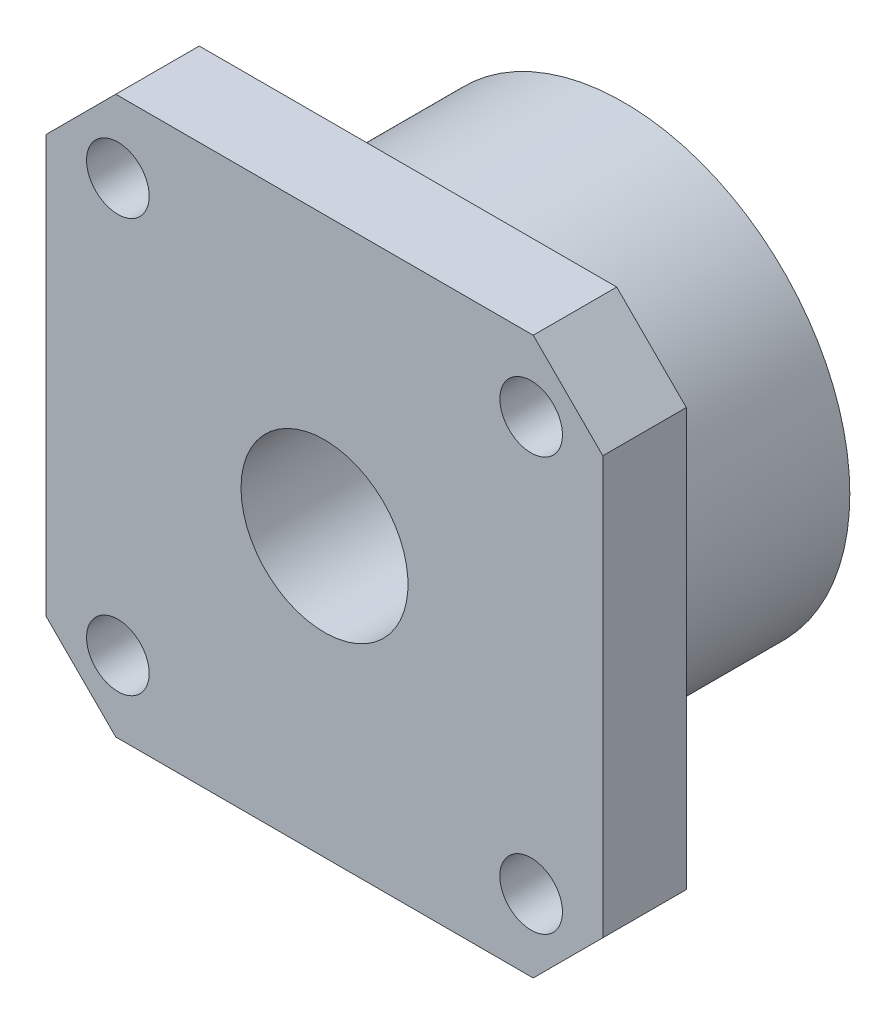
ISO-10303-21;
HEADER;
FILE_DESCRIPTION(('STEP AP214'),'2;1');
FILE_NAME('part.step','',(''),(''),'','','');
FILE_SCHEMA(('AUTOMOTIVE_DESIGN { 1 0 10303 214 1 1 1 1 }'));
ENDSEC;
DATA;
#1=APPLICATION_CONTEXT('core data for automotive mechanical design processes');
#2=APPLICATION_PROTOCOL_DEFINITION('international standard','automotive_design',2000,#1);
#3=PRODUCT_CONTEXT('',#1,'mechanical');
#4=PRODUCT('Part','Part','',(#3));
#5=PRODUCT_RELATED_PRODUCT_CATEGORY('part','',(#4));
#6=PRODUCT_DEFINITION_FORMATION('','',#4);
#7=PRODUCT_DEFINITION_CONTEXT('part definition',#1,'design');
#8=PRODUCT_DEFINITION('design','',#6,#7);
#9=PRODUCT_DEFINITION_SHAPE('','',#8);
#10=(LENGTH_UNIT() NAMED_UNIT(*) SI_UNIT(.MILLI.,.METRE.));
#11=(NAMED_UNIT(*) PLANE_ANGLE_UNIT() SI_UNIT($,.RADIAN.));
#12=(NAMED_UNIT(*) SI_UNIT($,.STERADIAN.) SOLID_ANGLE_UNIT());
#13=UNCERTAINTY_MEASURE_WITH_UNIT(LENGTH_MEASURE(1.E-05),#10,'distance_accuracy_value','');
#14=(GEOMETRIC_REPRESENTATION_CONTEXT(3) GLOBAL_UNCERTAINTY_ASSIGNED_CONTEXT((#13)) GLOBAL_UNIT_ASSIGNED_CONTEXT((#10,
#11,#12)) REPRESENTATION_CONTEXT('',''));
#15=CARTESIAN_POINT('',(0.,0.,0.));
#16=DIRECTION('',(0.,0.,1.));
#17=DIRECTION('',(1.,0.,0.));
#18=AXIS2_PLACEMENT_3D('',#15,#16,#17);
#19=CARTESIAN_POINT('',(0.,0.,6.));
#20=DIRECTION('',(0.,0.,1.));
#21=DIRECTION('',(1.,0.,0.));
#22=AXIS2_PLACEMENT_3D('',#19,#20,#21);
#23=PLANE('',#22);
#24=CARTESIAN_POINT('',(0.,0.,6.));
#25=DIRECTION('',(0.,0.,-1.));
#26=DIRECTION('',(-1.,0.,0.));
#27=AXIS2_PLACEMENT_3D('',#24,#25,#26);
#28=CIRCLE('',#27,6.);
#29=CARTESIAN_POINT('',(-6.,0.,6.));
#30=VERTEX_POINT('',#29);
#31=EDGE_CURVE('E405',#30,#30,#28,.T.);
#32=ORIENTED_EDGE('',*,*,#31,.T.);
#33=EDGE_LOOP('',(#32));
#34=FACE_BOUND('',#33,.T.);
#35=CARTESIAN_POINT('',(14.8492424049185,-14.8492424049165,6.));
#36=DIRECTION('',(0.,0.,1.));
#37=DIRECTION('',(1.,0.,0.));
#38=AXIS2_PLACEMENT_3D('',#35,#36,#37);
#39=CIRCLE('',#38,2.25);
#40=CARTESIAN_POINT('',(17.0992424049185,-14.8492424049165,6.));
#41=VERTEX_POINT('',#40);
#42=EDGE_CURVE('E232',#41,#41,#39,.T.);
#43=ORIENTED_EDGE('',*,*,#42,.F.);
#44=EDGE_LOOP('',(#43));
#45=FACE_BOUND('',#44,.T.);
#46=CARTESIAN_POINT('',(-14.8492424049175,14.8492424049175,6.));
#47=DIRECTION('',(0.,0.,1.));
#48=DIRECTION('',(1.,0.,0.));
#49=AXIS2_PLACEMENT_3D('',#46,#47,#48);
#50=CIRCLE('',#49,2.25);
#51=CARTESIAN_POINT('',(-12.5992424049175,14.8492424049175,6.));
#52=VERTEX_POINT('',#51);
#53=EDGE_CURVE('E148',#52,#52,#50,.T.);
#54=ORIENTED_EDGE('',*,*,#53,.F.);
#55=EDGE_LOOP('',(#54));
#56=FACE_BOUND('',#55,.T.);
#57=DIRECTION('',(0.,-1.,0.));
#58=VECTOR('',#57,1.);
#59=CARTESIAN_POINT('',(-20.,-20.,6.));
#60=LINE('',#59,#58);
#61=CARTESIAN_POINT('',(-20.,15.,6.));
#62=VERTEX_POINT('',#61);
#63=CARTESIAN_POINT('',(-20.,-15.,6.));
#64=VERTEX_POINT('',#63);
#65=EDGE_CURVE('E154',#62,#64,#60,.T.);
#66=ORIENTED_EDGE('',*,*,#65,.T.);
#67=DIRECTION('',(-0.707106781186546,0.707106781186549,0.));
#68=VECTOR('',#67,1.);
#69=CARTESIAN_POINT('',(-17.5,-17.5,6.));
#70=LINE('',#69,#68);
#71=CARTESIAN_POINT('',(-15.,-20.,6.));
#72=VERTEX_POINT('',#71);
#73=EDGE_CURVE('E178',#64,#72,#70,.F.);
#74=ORIENTED_EDGE('',*,*,#73,.T.);
#75=DIRECTION('',(1.,0.,0.));
#76=VECTOR('',#75,1.);
#77=CARTESIAN_POINT('',(20.,-20.,6.));
#78=LINE('',#77,#76);
#79=CARTESIAN_POINT('',(15.,-20.,6.));
#80=VERTEX_POINT('',#79);
#81=EDGE_CURVE('E131',#72,#80,#78,.T.);
#82=ORIENTED_EDGE('',*,*,#81,.T.);
#83=DIRECTION('',(-0.707106781186549,-0.707106781186546,0.));
#84=VECTOR('',#83,1.);
#85=CARTESIAN_POINT('',(17.5,-17.5,6.));
#86=LINE('',#85,#84);
#87=CARTESIAN_POINT('',(20.,-15.,6.));
#88=VERTEX_POINT('',#87);
#89=EDGE_CURVE('E175',#80,#88,#86,.F.);
#90=ORIENTED_EDGE('',*,*,#89,.T.);
#91=DIRECTION('',(0.,1.,0.));
#92=VECTOR('',#91,1.);
#93=CARTESIAN_POINT('',(20.,-20.,6.));
#94=LINE('',#93,#92);
#95=CARTESIAN_POINT('',(20.,15.,6.));
#96=VERTEX_POINT('',#95);
#97=EDGE_CURVE('E205',#88,#96,#94,.T.);
#98=ORIENTED_EDGE('',*,*,#97,.T.);
#99=DIRECTION('',(0.707106781186546,-0.707106781186549,0.));
#100=VECTOR('',#99,1.);
#101=CARTESIAN_POINT('',(17.5,17.5,6.));
#102=LINE('',#101,#100);
#103=CARTESIAN_POINT('',(15.,20.,6.));
#104=VERTEX_POINT('',#103);
#105=EDGE_CURVE('E65',#96,#104,#102,.F.);
#106=ORIENTED_EDGE('',*,*,#105,.T.);
#107=DIRECTION('',(-1.,0.,0.));
#108=VECTOR('',#107,1.);
#109=CARTESIAN_POINT('',(20.,20.,6.));
#110=LINE('',#109,#108);
#111=CARTESIAN_POINT('',(-15.,20.,6.));
#112=VERTEX_POINT('',#111);
#113=EDGE_CURVE('E156',#104,#112,#110,.T.);
#114=ORIENTED_EDGE('',*,*,#113,.T.);
#115=DIRECTION('',(0.707106781186548,0.707106781186547,0.));
#116=VECTOR('',#115,1.);
#117=CARTESIAN_POINT('',(-17.5,17.5,6.));
#118=LINE('',#117,#116);
#119=EDGE_CURVE('E170',#112,#62,#118,.F.);
#120=ORIENTED_EDGE('',*,*,#119,.T.);
#121=EDGE_LOOP('',(#66,#74,#82,#90,#98,#106,#114,#120));
#122=FACE_BOUND('',#121,.T.);
#123=CARTESIAN_POINT('',(14.8492424049175,14.8492424049185,6.));
#124=DIRECTION('',(0.,0.,1.));
#125=DIRECTION('',(1.,0.,0.));
#126=AXIS2_PLACEMENT_3D('',#123,#124,#125);
#127=CIRCLE('',#126,2.25);
#128=CARTESIAN_POINT('',(17.0992424049175,14.8492424049185,6.));
#129=VERTEX_POINT('',#128);
#130=EDGE_CURVE('E220',#129,#129,#127,.T.);
#131=ORIENTED_EDGE('',*,*,#130,.F.);
#132=EDGE_LOOP('',(#131));
#133=FACE_BOUND('',#132,.T.);
#134=CARTESIAN_POINT('',(-14.8492424049165,-14.8492424049175,6.));
#135=DIRECTION('',(0.,0.,1.));
#136=DIRECTION('',(1.,0.,0.));
#137=AXIS2_PLACEMENT_3D('',#134,#135,#136);
#138=CIRCLE('',#137,2.25);
#139=CARTESIAN_POINT('',(-12.5992424049165,-14.8492424049175,6.));
#140=VERTEX_POINT('',#139);
#141=EDGE_CURVE('E223',#140,#140,#138,.T.);
#142=ORIENTED_EDGE('',*,*,#141,.F.);
#143=EDGE_LOOP('',(#142));
#144=FACE_BOUND('',#143,.T.);
#145=ADVANCED_FACE('F41',(#34,#45,#56,#122,#133,#144),#23,.T.);
#146=CARTESIAN_POINT('',(0.,0.,0.));
#147=DIRECTION('',(0.,0.,1.));
#148=DIRECTION('',(1.,0.,0.));
#149=AXIS2_PLACEMENT_3D('',#146,#147,#148);
#150=PLANE('',#149);
#151=CARTESIAN_POINT('',(0.,0.,0.));
#152=DIRECTION('',(0.,0.,1.));
#153=DIRECTION('',(1.,0.,0.));
#154=AXIS2_PLACEMENT_3D('',#151,#152,#153);
#155=CIRCLE('',#154,16.25);
#156=CARTESIAN_POINT('',(16.25,0.,0.));
#157=VERTEX_POINT('',#156);
#158=EDGE_CURVE('E11',#157,#157,#155,.F.);
#159=ORIENTED_EDGE('',*,*,#158,.F.);
#160=EDGE_LOOP('',(#159));
#161=FACE_BOUND('',#160,.T.);
#162=DIRECTION('',(1.,0.,0.));
#163=VECTOR('',#162,1.);
#164=CARTESIAN_POINT('',(20.,-20.,0.));
#165=LINE('',#164,#163);
#166=CARTESIAN_POINT('',(-15.,-20.,0.));
#167=VERTEX_POINT('',#166);
#168=CARTESIAN_POINT('',(15.,-20.,0.));
#169=VERTEX_POINT('',#168);
#170=EDGE_CURVE('E128',#167,#169,#165,.T.);
#171=ORIENTED_EDGE('',*,*,#170,.F.);
#172=DIRECTION('',(0.707106781186546,-0.707106781186549,0.));
#173=VECTOR('',#172,1.);
#174=CARTESIAN_POINT('',(-15.,-20.,0.));
#175=LINE('',#174,#173);
#176=CARTESIAN_POINT('',(-20.,-15.,0.));
#177=VERTEX_POINT('',#176);
#178=EDGE_CURVE('E110',#167,#177,#175,.F.);
#179=ORIENTED_EDGE('',*,*,#178,.T.);
#180=DIRECTION('',(0.,-1.,0.));
#181=VECTOR('',#180,1.);
#182=CARTESIAN_POINT('',(-20.,-20.,0.));
#183=LINE('',#182,#181);
#184=CARTESIAN_POINT('',(-20.,15.,0.));
#185=VERTEX_POINT('',#184);
#186=EDGE_CURVE('E141',#185,#177,#183,.T.);
#187=ORIENTED_EDGE('',*,*,#186,.F.);
#188=DIRECTION('',(-0.707106781186548,-0.707106781186547,0.));
#189=VECTOR('',#188,1.);
#190=CARTESIAN_POINT('',(-20.,15.,0.));
#191=LINE('',#190,#189);
#192=CARTESIAN_POINT('',(-15.,20.,0.));
#193=VERTEX_POINT('',#192);
#194=EDGE_CURVE('E133',#185,#193,#191,.F.);
#195=ORIENTED_EDGE('',*,*,#194,.T.);
#196=DIRECTION('',(-1.,0.,0.));
#197=VECTOR('',#196,1.);
#198=CARTESIAN_POINT('',(20.,20.,0.));
#199=LINE('',#198,#197);
#200=CARTESIAN_POINT('',(15.,20.,0.));
#201=VERTEX_POINT('',#200);
#202=EDGE_CURVE('E146',#201,#193,#199,.T.);
#203=ORIENTED_EDGE('',*,*,#202,.F.);
#204=DIRECTION('',(-0.707106781186546,0.707106781186549,0.));
#205=VECTOR('',#204,1.);
#206=CARTESIAN_POINT('',(15.,20.,0.));
#207=LINE('',#206,#205);
#208=CARTESIAN_POINT('',(20.,15.,0.));
#209=VERTEX_POINT('',#208);
#210=EDGE_CURVE('E160',#201,#209,#207,.F.);
#211=ORIENTED_EDGE('',*,*,#210,.T.);
#212=DIRECTION('',(0.,1.,0.));
#213=VECTOR('',#212,1.);
#214=CARTESIAN_POINT('',(20.,-20.,0.));
#215=LINE('',#214,#213);
#216=CARTESIAN_POINT('',(20.,-15.,0.));
#217=VERTEX_POINT('',#216);
#218=EDGE_CURVE('E140',#217,#209,#215,.T.);
#219=ORIENTED_EDGE('',*,*,#218,.F.);
#220=DIRECTION('',(0.707106781186549,0.707106781186546,0.));
#221=VECTOR('',#220,1.);
#222=CARTESIAN_POINT('',(20.,-15.,0.));
#223=LINE('',#222,#221);
#224=EDGE_CURVE('E122',#217,#169,#223,.F.);
#225=ORIENTED_EDGE('',*,*,#224,.T.);
#226=EDGE_LOOP('',(#171,#179,#187,#195,#203,#211,#219,#225));
#227=FACE_BOUND('',#226,.T.);
#228=CARTESIAN_POINT('',(-14.8492424049175,14.8492424049175,0.));
#229=DIRECTION('',(0.,0.,1.));
#230=DIRECTION('',(1.,0.,0.));
#231=AXIS2_PLACEMENT_3D('',#228,#229,#230);
#232=CIRCLE('',#231,2.25);
#233=CARTESIAN_POINT('',(-12.5992424049175,14.8492424049175,0.));
#234=VERTEX_POINT('',#233);
#235=EDGE_CURVE('E208',#234,#234,#232,.T.);
#236=ORIENTED_EDGE('',*,*,#235,.T.);
#237=EDGE_LOOP('',(#236));
#238=FACE_BOUND('',#237,.T.);
#239=CARTESIAN_POINT('',(14.8492424049175,14.8492424049185,0.));
#240=DIRECTION('',(0.,0.,1.));
#241=DIRECTION('',(1.,0.,0.));
#242=AXIS2_PLACEMENT_3D('',#239,#240,#241);
#243=CIRCLE('',#242,2.25);
#244=CARTESIAN_POINT('',(17.0992424049175,14.8492424049185,0.));
#245=VERTEX_POINT('',#244);
#246=EDGE_CURVE('E242',#245,#245,#243,.T.);
#247=ORIENTED_EDGE('',*,*,#246,.T.);
#248=EDGE_LOOP('',(#247));
#249=FACE_BOUND('',#248,.T.);
#250=CARTESIAN_POINT('',(14.8492424049185,-14.8492424049165,0.));
#251=DIRECTION('',(0.,0.,1.));
#252=DIRECTION('',(1.,0.,0.));
#253=AXIS2_PLACEMENT_3D('',#250,#251,#252);
#254=CIRCLE('',#253,2.25);
#255=CARTESIAN_POINT('',(17.0992424049185,-14.8492424049165,0.));
#256=VERTEX_POINT('',#255);
#257=EDGE_CURVE('E226',#256,#256,#254,.T.);
#258=ORIENTED_EDGE('',*,*,#257,.T.);
#259=EDGE_LOOP('',(#258));
#260=FACE_BOUND('',#259,.T.);
#261=CARTESIAN_POINT('',(-14.8492424049165,-14.8492424049175,0.));
#262=DIRECTION('',(0.,0.,1.));
#263=DIRECTION('',(1.,0.,0.));
#264=AXIS2_PLACEMENT_3D('',#261,#262,#263);
#265=CIRCLE('',#264,2.25);
#266=CARTESIAN_POINT('',(-12.5992424049165,-14.8492424049175,0.));
#267=VERTEX_POINT('',#266);
#268=EDGE_CURVE('E227',#267,#267,#265,.T.);
#269=ORIENTED_EDGE('',*,*,#268,.T.);
#270=EDGE_LOOP('',(#269));
#271=FACE_BOUND('',#270,.T.);
#272=ADVANCED_FACE('F136',(#161,#227,#238,#249,#260,#271),#150,.F.);
#273=CARTESIAN_POINT('',(-20.,-20.,6.));
#274=DIRECTION('',(1.,0.,0.));
#275=DIRECTION('',(0.,0.,-1.));
#276=AXIS2_PLACEMENT_3D('',#273,#274,#275);
#277=PLANE('',#276);
#278=ORIENTED_EDGE('',*,*,#186,.T.);
#279=DIRECTION('',(0.,0.,1.));
#280=VECTOR('',#279,1.);
#281=CARTESIAN_POINT('',(-20.,-15.,6.));
#282=LINE('',#281,#280);
#283=EDGE_CURVE('E115',#177,#64,#282,.T.);
#284=ORIENTED_EDGE('',*,*,#283,.T.);
#285=ORIENTED_EDGE('',*,*,#65,.F.);
#286=DIRECTION('',(0.,0.,-1.));
#287=VECTOR('',#286,1.);
#288=CARTESIAN_POINT('',(-20.,15.,6.));
#289=LINE('',#288,#287);
#290=EDGE_CURVE('E121',#62,#185,#289,.T.);
#291=ORIENTED_EDGE('',*,*,#290,.T.);
#292=EDGE_LOOP('',(#278,#284,#285,#291));
#293=FACE_BOUND('',#292,.T.);
#294=ADVANCED_FACE('F200',(#293),#277,.F.);
#295=CARTESIAN_POINT('',(20.,-20.,6.));
#296=DIRECTION('',(0.,1.,0.));
#297=DIRECTION('',(-1.,0.,0.));
#298=AXIS2_PLACEMENT_3D('',#295,#296,#297);
#299=PLANE('',#298);
#300=ORIENTED_EDGE('',*,*,#81,.F.);
#301=DIRECTION('',(0.,0.,-1.));
#302=VECTOR('',#301,1.);
#303=CARTESIAN_POINT('',(-15.,-20.,6.));
#304=LINE('',#303,#302);
#305=EDGE_CURVE('E114',#72,#167,#304,.T.);
#306=ORIENTED_EDGE('',*,*,#305,.T.);
#307=ORIENTED_EDGE('',*,*,#170,.T.);
#308=DIRECTION('',(0.,0.,1.));
#309=VECTOR('',#308,1.);
#310=CARTESIAN_POINT('',(15.,-20.,6.));
#311=LINE('',#310,#309);
#312=EDGE_CURVE('E134',#169,#80,#311,.T.);
#313=ORIENTED_EDGE('',*,*,#312,.T.);
#314=EDGE_LOOP('',(#300,#306,#307,#313));
#315=FACE_BOUND('',#314,.T.);
#316=ADVANCED_FACE('F127',(#315),#299,.F.);
#317=CARTESIAN_POINT('',(20.,-20.,6.));
#318=DIRECTION('',(-1.,0.,0.));
#319=DIRECTION('',(0.,0.,1.));
#320=AXIS2_PLACEMENT_3D('',#317,#318,#319);
#321=PLANE('',#320);
#322=ORIENTED_EDGE('',*,*,#97,.F.);
#323=DIRECTION('',(0.,0.,-1.));
#324=VECTOR('',#323,1.);
#325=CARTESIAN_POINT('',(20.,-15.,6.));
#326=LINE('',#325,#324);
#327=EDGE_CURVE('E184',#88,#217,#326,.T.);
#328=ORIENTED_EDGE('',*,*,#327,.T.);
#329=ORIENTED_EDGE('',*,*,#218,.T.);
#330=DIRECTION('',(0.,0.,1.));
#331=VECTOR('',#330,1.);
#332=CARTESIAN_POINT('',(20.,15.,6.));
#333=LINE('',#332,#331);
#334=EDGE_CURVE('E181',#209,#96,#333,.T.);
#335=ORIENTED_EDGE('',*,*,#334,.T.);
#336=EDGE_LOOP('',(#322,#328,#329,#335));
#337=FACE_BOUND('',#336,.T.);
#338=ADVANCED_FACE('F268',(#337),#321,.F.);
#339=CARTESIAN_POINT('',(20.,20.,6.));
#340=DIRECTION('',(0.,-1.,0.));
#341=DIRECTION('',(0.,0.,-1.));
#342=AXIS2_PLACEMENT_3D('',#339,#340,#341);
#343=PLANE('',#342);
#344=ORIENTED_EDGE('',*,*,#113,.F.);
#345=DIRECTION('',(0.,0.,-1.));
#346=VECTOR('',#345,1.);
#347=CARTESIAN_POINT('',(15.,20.,6.));
#348=LINE('',#347,#346);
#349=EDGE_CURVE('E51',#104,#201,#348,.T.);
#350=ORIENTED_EDGE('',*,*,#349,.T.);
#351=ORIENTED_EDGE('',*,*,#202,.T.);
#352=DIRECTION('',(0.,0.,1.));
#353=VECTOR('',#352,1.);
#354=CARTESIAN_POINT('',(-15.,20.,6.));
#355=LINE('',#354,#353);
#356=EDGE_CURVE('E58',#193,#112,#355,.T.);
#357=ORIENTED_EDGE('',*,*,#356,.T.);
#358=EDGE_LOOP('',(#344,#350,#351,#357));
#359=FACE_BOUND('',#358,.T.);
#360=ADVANCED_FACE('F193',(#359),#343,.F.);
#361=CARTESIAN_POINT('',(-14.8492424049175,14.8492424049175,6.));
#362=DIRECTION('',(0.,0.,-1.));
#363=DIRECTION('',(-1.,0.,0.));
#364=AXIS2_PLACEMENT_3D('',#361,#362,#363);
#365=CYLINDRICAL_SURFACE('',#364,2.25);
#366=ORIENTED_EDGE('',*,*,#53,.T.);
#367=EDGE_LOOP('',(#366));
#368=FACE_BOUND('',#367,.T.);
#369=ORIENTED_EDGE('',*,*,#235,.F.);
#370=EDGE_LOOP('',(#369));
#371=FACE_BOUND('',#370,.T.);
#372=ADVANCED_FACE('F257',(#368,#371),#365,.F.);
#373=CARTESIAN_POINT('',(14.8492424049175,14.8492424049185,6.));
#374=DIRECTION('',(0.,0.,-1.));
#375=DIRECTION('',(-1.,0.,0.));
#376=AXIS2_PLACEMENT_3D('',#373,#374,#375);
#377=CYLINDRICAL_SURFACE('',#376,2.25);
#378=ORIENTED_EDGE('',*,*,#130,.T.);
#379=EDGE_LOOP('',(#378));
#380=FACE_BOUND('',#379,.T.);
#381=ORIENTED_EDGE('',*,*,#246,.F.);
#382=EDGE_LOOP('',(#381));
#383=FACE_BOUND('',#382,.T.);
#384=ADVANCED_FACE('F259',(#380,#383),#377,.F.);
#385=CARTESIAN_POINT('',(14.8492424049185,-14.8492424049165,6.));
#386=DIRECTION('',(0.,0.,-1.));
#387=DIRECTION('',(-1.,0.,0.));
#388=AXIS2_PLACEMENT_3D('',#385,#386,#387);
#389=CYLINDRICAL_SURFACE('',#388,2.25);
#390=ORIENTED_EDGE('',*,*,#42,.T.);
#391=EDGE_LOOP('',(#390));
#392=FACE_BOUND('',#391,.T.);
#393=ORIENTED_EDGE('',*,*,#257,.F.);
#394=EDGE_LOOP('',(#393));
#395=FACE_BOUND('',#394,.T.);
#396=ADVANCED_FACE('F265',(#392,#395),#389,.F.);
#397=CARTESIAN_POINT('',(-14.8492424049165,-14.8492424049175,6.));
#398=DIRECTION('',(0.,0.,-1.));
#399=DIRECTION('',(-1.,0.,0.));
#400=AXIS2_PLACEMENT_3D('',#397,#398,#399);
#401=CYLINDRICAL_SURFACE('',#400,2.25);
#402=ORIENTED_EDGE('',*,*,#141,.T.);
#403=EDGE_LOOP('',(#402));
#404=FACE_BOUND('',#403,.T.);
#405=ORIENTED_EDGE('',*,*,#268,.F.);
#406=EDGE_LOOP('',(#405));
#407=FACE_BOUND('',#406,.T.);
#408=ADVANCED_FACE('F289',(#404,#407),#401,.F.);
#409=CARTESIAN_POINT('',(-15.,-20.,6.));
#410=DIRECTION('',(0.707106781186549,0.707106781186546,0.));
#411=DIRECTION('',(0.,0.,-1.));
#412=AXIS2_PLACEMENT_3D('',#409,#410,#411);
#413=PLANE('',#412);
#414=ORIENTED_EDGE('',*,*,#73,.F.);
#415=ORIENTED_EDGE('',*,*,#283,.F.);
#416=ORIENTED_EDGE('',*,*,#178,.F.);
#417=ORIENTED_EDGE('',*,*,#305,.F.);
#418=EDGE_LOOP('',(#414,#415,#416,#417));
#419=FACE_BOUND('',#418,.T.);
#420=ADVANCED_FACE('F113',(#419),#413,.F.);
#421=CARTESIAN_POINT('',(20.,-15.,6.));
#422=DIRECTION('',(-0.707106781186546,0.707106781186549,0.));
#423=DIRECTION('',(0.,0.,-1.));
#424=AXIS2_PLACEMENT_3D('',#421,#422,#423);
#425=PLANE('',#424);
#426=ORIENTED_EDGE('',*,*,#89,.F.);
#427=ORIENTED_EDGE('',*,*,#312,.F.);
#428=ORIENTED_EDGE('',*,*,#224,.F.);
#429=ORIENTED_EDGE('',*,*,#327,.F.);
#430=EDGE_LOOP('',(#426,#427,#428,#429));
#431=FACE_BOUND('',#430,.T.);
#432=ADVANCED_FACE('F288',(#431),#425,.F.);
#433=CARTESIAN_POINT('',(15.,20.,6.));
#434=DIRECTION('',(-0.707106781186549,-0.707106781186546,0.));
#435=DIRECTION('',(0.,0.,-1.));
#436=AXIS2_PLACEMENT_3D('',#433,#434,#435);
#437=PLANE('',#436);
#438=ORIENTED_EDGE('',*,*,#105,.F.);
#439=ORIENTED_EDGE('',*,*,#334,.F.);
#440=ORIENTED_EDGE('',*,*,#210,.F.);
#441=ORIENTED_EDGE('',*,*,#349,.F.);
#442=EDGE_LOOP('',(#438,#439,#440,#441));
#443=FACE_BOUND('',#442,.T.);
#444=ADVANCED_FACE('F294',(#443),#437,.F.);
#445=CARTESIAN_POINT('',(-20.,15.,6.));
#446=DIRECTION('',(0.707106781186547,-0.707106781186548,0.));
#447=DIRECTION('',(0.,0.,-1.));
#448=AXIS2_PLACEMENT_3D('',#445,#446,#447);
#449=PLANE('',#448);
#450=ORIENTED_EDGE('',*,*,#119,.F.);
#451=ORIENTED_EDGE('',*,*,#356,.F.);
#452=ORIENTED_EDGE('',*,*,#194,.F.);
#453=ORIENTED_EDGE('',*,*,#290,.F.);
#454=EDGE_LOOP('',(#450,#451,#452,#453));
#455=FACE_BOUND('',#454,.T.);
#456=ADVANCED_FACE('F44',(#455),#449,.F.);
#457=CARTESIAN_POINT('',(0.,0.,-15.5));
#458=DIRECTION('',(0.,0.,-1.));
#459=DIRECTION('',(-1.,0.,0.));
#460=AXIS2_PLACEMENT_3D('',#457,#458,#459);
#461=PLANE('',#460);
#462=CARTESIAN_POINT('',(0.,0.,-15.5));
#463=DIRECTION('',(0.,0.,-1.));
#464=DIRECTION('',(-1.,0.,0.));
#465=AXIS2_PLACEMENT_3D('',#462,#463,#464);
#466=CIRCLE('',#465,16.25);
#467=CARTESIAN_POINT('',(-16.25,0.,-15.5));
#468=VERTEX_POINT('',#467);
#469=EDGE_CURVE('E235',#468,#468,#466,.T.);
#470=ORIENTED_EDGE('',*,*,#469,.T.);
#471=EDGE_LOOP('',(#470));
#472=FACE_BOUND('',#471,.T.);
#473=CARTESIAN_POINT('',(0.,0.,-15.5));
#474=DIRECTION('',(0.,0.,-1.));
#475=DIRECTION('',(-1.,0.,0.));
#476=AXIS2_PLACEMENT_3D('',#473,#474,#475);
#477=CIRCLE('',#476,6.);
#478=CARTESIAN_POINT('',(-6.,0.,-15.5));
#479=VERTEX_POINT('',#478);
#480=EDGE_CURVE('E402',#479,#479,#477,.T.);
#481=ORIENTED_EDGE('',*,*,#480,.F.);
#482=EDGE_LOOP('',(#481));
#483=FACE_BOUND('',#482,.T.);
#484=ADVANCED_FACE('F302',(#472,#483),#461,.T.);
#485=CARTESIAN_POINT('',(0.,0.,-15.5));
#486=DIRECTION('',(0.,0.,1.));
#487=DIRECTION('',(1.,0.,0.));
#488=AXIS2_PLACEMENT_3D('',#485,#486,#487);
#489=CYLINDRICAL_SURFACE('',#488,16.25);
#490=ORIENTED_EDGE('',*,*,#469,.F.);
#491=EDGE_LOOP('',(#490));
#492=FACE_BOUND('',#491,.T.);
#493=ORIENTED_EDGE('',*,*,#158,.T.);
#494=EDGE_LOOP('',(#493));
#495=FACE_BOUND('',#494,.T.);
#496=ADVANCED_FACE('F310',(#492,#495),#489,.T.);
#497=CARTESIAN_POINT('',(0.,0.,-15.5));
#498=DIRECTION('',(0.,0.,1.));
#499=DIRECTION('',(1.,0.,0.));
#500=AXIS2_PLACEMENT_3D('',#497,#498,#499);
#501=CYLINDRICAL_SURFACE('',#500,6.);
#502=ORIENTED_EDGE('',*,*,#480,.T.);
#503=EDGE_LOOP('',(#502));
#504=FACE_BOUND('',#503,.T.);
#505=ORIENTED_EDGE('',*,*,#31,.F.);
#506=EDGE_LOOP('',(#505));
#507=FACE_BOUND('',#506,.T.);
#508=ADVANCED_FACE('F316',(#504,#507),#501,.F.);
#509=CLOSED_SHELL('',(#145,#272,#294,#316,#338,#360,#372,#384,#396,#408,#420,#432,#444,#456,
#484,#496,#508));
#510=MANIFOLD_SOLID_BREP('B2',#509);
#511=ADVANCED_BREP_SHAPE_REPRESENTATION('',(#18,#510),#14);
#512=SHAPE_DEFINITION_REPRESENTATION(#9,#511);
ENDSEC;
END-ISO-10303-21;
